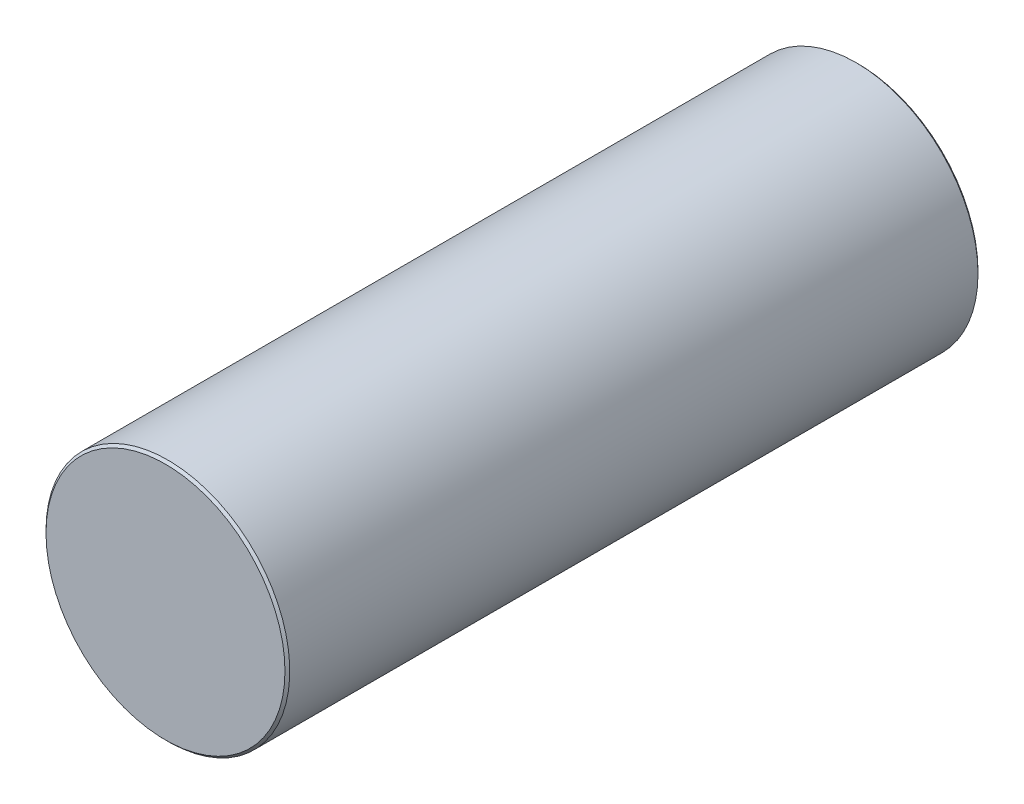
ISO-10303-21;
HEADER;
FILE_DESCRIPTION(('STEP AP214'),'2;1');
FILE_NAME('part.step','',(''),(''),'','','');
FILE_SCHEMA(('AUTOMOTIVE_DESIGN { 1 0 10303 214 1 1 1 1 }'));
ENDSEC;
DATA;
#1=APPLICATION_CONTEXT('core data for automotive mechanical design processes');
#2=APPLICATION_PROTOCOL_DEFINITION('international standard','automotive_design',2000,#1);
#3=PRODUCT_CONTEXT('',#1,'mechanical');
#4=PRODUCT('Part','Part','',(#3));
#5=PRODUCT_RELATED_PRODUCT_CATEGORY('part','',(#4));
#6=PRODUCT_DEFINITION_FORMATION('','',#4);
#7=PRODUCT_DEFINITION_CONTEXT('part definition',#1,'design');
#8=PRODUCT_DEFINITION('design','',#6,#7);
#9=PRODUCT_DEFINITION_SHAPE('','',#8);
#10=(LENGTH_UNIT() NAMED_UNIT(*) SI_UNIT(.MILLI.,.METRE.));
#11=(NAMED_UNIT(*) PLANE_ANGLE_UNIT() SI_UNIT($,.RADIAN.));
#12=(NAMED_UNIT(*) SI_UNIT($,.STERADIAN.) SOLID_ANGLE_UNIT());
#13=UNCERTAINTY_MEASURE_WITH_UNIT(LENGTH_MEASURE(1.E-05),#10,'distance_accuracy_value','');
#14=(GEOMETRIC_REPRESENTATION_CONTEXT(3) GLOBAL_UNCERTAINTY_ASSIGNED_CONTEXT((#13)) GLOBAL_UNIT_ASSIGNED_CONTEXT((#10,
#11,#12)) REPRESENTATION_CONTEXT('',''));
#15=CARTESIAN_POINT('',(0.,0.,0.));
#16=DIRECTION('',(0.,0.,1.));
#17=DIRECTION('',(1.,0.,0.));
#18=AXIS2_PLACEMENT_3D('',#15,#16,#17);
#19=CARTESIAN_POINT('',(0.,0.,14.5));
#20=DIRECTION('',(0.,0.,-1.));
#21=DIRECTION('',(-1.,0.,0.));
#22=AXIS2_PLACEMENT_3D('',#19,#20,#21);
#23=CYLINDRICAL_SURFACE('',#22,2.55);
#24=CARTESIAN_POINT('',(0.,0.,14.45));
#25=DIRECTION('',(0.,0.,1.));
#26=DIRECTION('',(1.,0.,0.));
#27=AXIS2_PLACEMENT_3D('',#24,#25,#26);
#28=CIRCLE('',#27,2.55);
#29=CARTESIAN_POINT('',(-2.55,0.,14.45));
#30=VERTEX_POINT('',#29);
#31=EDGE_CURVE('E54',#30,#30,#28,.F.);
#32=CARTESIAN_POINT('',(0.,0.,0.0500000000000136));
#33=DIRECTION('',(0.,0.,1.));
#34=DIRECTION('',(1.,0.,0.));
#35=AXIS2_PLACEMENT_3D('',#32,#33,#34);
#36=CIRCLE('',#35,2.55);
#37=CARTESIAN_POINT('',(-2.55,0.,0.0500000000000118));
#38=VERTEX_POINT('',#37);
#39=EDGE_CURVE('E59',#38,#38,#36,.T.);
#40=CARTESIAN_POINT('',(-2.55,0.,14.45));
#41=CARTESIAN_POINT('',(-2.55,0.,14.3));
#42=CARTESIAN_POINT('',(-2.55,0.,14.15));
#43=CARTESIAN_POINT('',(-2.55,0.,13.85));
#44=CARTESIAN_POINT('',(-2.55,0.,13.7));
#45=CARTESIAN_POINT('',(-2.55,0.,13.4));
#46=CARTESIAN_POINT('',(-2.55,0.,13.25));
#47=CARTESIAN_POINT('',(-2.55,0.,12.95));
#48=CARTESIAN_POINT('',(-2.55,0.,12.8));
#49=CARTESIAN_POINT('',(-2.55,0.,12.5));
#50=CARTESIAN_POINT('',(-2.55,0.,12.35));
#51=CARTESIAN_POINT('',(-2.55,0.,12.05));
#52=CARTESIAN_POINT('',(-2.55,0.,11.9));
#53=CARTESIAN_POINT('',(-2.55,0.,11.6));
#54=CARTESIAN_POINT('',(-2.55,0.,11.45));
#55=CARTESIAN_POINT('',(-2.55,0.,11.15));
#56=CARTESIAN_POINT('',(-2.55,0.,11.));
#57=CARTESIAN_POINT('',(-2.55,0.,10.7));
#58=CARTESIAN_POINT('',(-2.55,0.,10.55));
#59=CARTESIAN_POINT('',(-2.55,0.,10.25));
#60=CARTESIAN_POINT('',(-2.55,0.,10.1));
#61=CARTESIAN_POINT('',(-2.55,0.,9.80000000000001));
#62=CARTESIAN_POINT('',(-2.55,0.,9.65000000000001));
#63=CARTESIAN_POINT('',(-2.55,0.,9.35000000000001));
#64=CARTESIAN_POINT('',(-2.55,0.,9.20000000000001));
#65=CARTESIAN_POINT('',(-2.55,0.,8.90000000000001));
#66=CARTESIAN_POINT('',(-2.55,0.,8.75000000000001));
#67=CARTESIAN_POINT('',(-2.55,0.,8.45000000000001));
#68=CARTESIAN_POINT('',(-2.55,0.,8.30000000000001));
#69=CARTESIAN_POINT('',(-2.55,0.,8.00000000000001));
#70=CARTESIAN_POINT('',(-2.55,0.,7.85000000000001));
#71=CARTESIAN_POINT('',(-2.55,0.,7.55000000000001));
#72=CARTESIAN_POINT('',(-2.55,0.,7.40000000000001));
#73=CARTESIAN_POINT('',(-2.55,0.,7.10000000000001));
#74=CARTESIAN_POINT('',(-2.55,0.,6.95000000000001));
#75=CARTESIAN_POINT('',(-2.55,0.,6.65000000000001));
#76=CARTESIAN_POINT('',(-2.55,0.,6.50000000000001));
#77=CARTESIAN_POINT('',(-2.55,0.,6.20000000000001));
#78=CARTESIAN_POINT('',(-2.55,0.,6.05000000000001));
#79=CARTESIAN_POINT('',(-2.55,0.,5.75000000000001));
#80=CARTESIAN_POINT('',(-2.55,0.,5.60000000000001));
#81=CARTESIAN_POINT('',(-2.55,0.,5.30000000000001));
#82=CARTESIAN_POINT('',(-2.55,0.,5.15000000000001));
#83=CARTESIAN_POINT('',(-2.55,0.,4.85000000000001));
#84=CARTESIAN_POINT('',(-2.55,0.,4.70000000000001));
#85=CARTESIAN_POINT('',(-2.55,0.,4.40000000000001));
#86=CARTESIAN_POINT('',(-2.55,0.,4.25000000000001));
#87=CARTESIAN_POINT('',(-2.55,0.,3.95000000000001));
#88=CARTESIAN_POINT('',(-2.55,0.,3.80000000000001));
#89=CARTESIAN_POINT('',(-2.55,0.,3.50000000000001));
#90=CARTESIAN_POINT('',(-2.55,0.,3.35000000000001));
#91=CARTESIAN_POINT('',(-2.55,0.,3.05000000000001));
#92=CARTESIAN_POINT('',(-2.55,0.,2.90000000000001));
#93=CARTESIAN_POINT('',(-2.55,0.,2.60000000000001));
#94=CARTESIAN_POINT('',(-2.55,0.,2.45000000000001));
#95=CARTESIAN_POINT('',(-2.55,0.,2.15000000000001));
#96=CARTESIAN_POINT('',(-2.55,0.,2.00000000000001));
#97=CARTESIAN_POINT('',(-2.55,0.,1.70000000000001));
#98=CARTESIAN_POINT('',(-2.55,0.,1.55000000000001));
#99=CARTESIAN_POINT('',(-2.55,0.,1.25000000000001));
#100=CARTESIAN_POINT('',(-2.55,0.,1.10000000000001));
#101=CARTESIAN_POINT('',(-2.55,0.,0.80000000000001));
#102=CARTESIAN_POINT('',(-2.55,0.,0.65000000000001));
#103=CARTESIAN_POINT('',(-2.55,0.,0.350000000000011));
#104=CARTESIAN_POINT('',(-2.55,0.,0.200000000000012));
#105=CARTESIAN_POINT('',(-2.55,0.,0.0500000000000118));
#106=B_SPLINE_CURVE_WITH_KNOTS('',3,(#40,#41,#42,#43,#44,#45,#46,#47,#48,#49,#50,#51,#52,#53,
#54,#55,#56,#57,#58,#59,#60,#61,#62,#63,#64,#65,#66,#67,#68,#69,#70,#71,#72,#73,#74,#75,#76,#77,
#78,#79,#80,#81,#82,#83,#84,#85,#86,#87,#88,#89,#90,#91,#92,#93,#94,#95,#96,#97,#98,#99,#100,
#101,#102,#103,#104,#105),.UNSPECIFIED.,.F.,.F.,(4,2,2,2,2,2,2,2,2,2,2,2,2,2,2,2,2,2,2,2,2,2,2,
2,2,2,2,2,2,2,2,2,4),(0.,0.450000000000001,0.9,1.35,1.8,2.25,2.7,3.15,3.6,4.05,4.5,4.95,5.4,
5.85,6.3,6.75,7.2,7.65,8.1,8.55,9.,9.45,9.9,10.35,10.8,11.25,11.7,12.15,12.6,13.05,13.5,13.95,
14.4),.UNSPECIFIED.);
#107=EDGE_CURVE('BSEAM45',#30,#38,#106,.T.);
#108=ORIENTED_EDGE('',*,*,#31,.T.);
#109=ORIENTED_EDGE('',*,*,#39,.T.);
#110=ORIENTED_EDGE('',*,*,#107,.T.);
#111=ORIENTED_EDGE('',*,*,#107,.F.);
#112=EDGE_LOOP('',(#108,#110,#109,#111));
#113=FACE_BOUND('',#112,.T.);
#114=ADVANCED_FACE('F45',(#113),#23,.T.);
#115=CARTESIAN_POINT('',(0.,0.,14.5));
#116=DIRECTION('',(0.,0.,1.));
#117=DIRECTION('',(1.,0.,0.));
#118=AXIS2_PLACEMENT_3D('',#115,#116,#117);
#119=PLANE('',#118);
#120=CARTESIAN_POINT('',(0.,0.,14.5));
#121=DIRECTION('',(0.,0.,1.));
#122=DIRECTION('',(1.,0.,0.));
#123=AXIS2_PLACEMENT_3D('',#120,#121,#122);
#124=CIRCLE('',#123,2.50000000000001);
#125=CARTESIAN_POINT('',(-2.50000000000001,0.,14.5));
#126=VERTEX_POINT('',#125);
#127=EDGE_CURVE('E64',#126,#126,#124,.T.);
#128=ORIENTED_EDGE('',*,*,#127,.T.);
#129=EDGE_LOOP('',(#128));
#130=FACE_BOUND('',#129,.T.);
#131=ADVANCED_FACE('F71',(#130),#119,.T.);
#132=CARTESIAN_POINT('',(0.,0.,0.));
#133=DIRECTION('',(0.,0.,1.));
#134=DIRECTION('',(1.,0.,0.));
#135=AXIS2_PLACEMENT_3D('',#132,#133,#134);
#136=PLANE('',#135);
#137=CARTESIAN_POINT('',(0.,0.,0.));
#138=DIRECTION('',(0.,0.,1.));
#139=DIRECTION('',(1.,0.,0.));
#140=AXIS2_PLACEMENT_3D('',#137,#138,#139);
#141=CIRCLE('',#140,2.49999999999998);
#142=CARTESIAN_POINT('',(2.49999999999998,0.,0.));
#143=VERTEX_POINT('',#142);
#144=EDGE_CURVE('E10',#143,#143,#141,.F.);
#145=ORIENTED_EDGE('',*,*,#144,.T.);
#146=EDGE_LOOP('',(#145));
#147=FACE_BOUND('',#146,.T.);
#148=ADVANCED_FACE('F75',(#147),#136,.F.);
#149=CARTESIAN_POINT('',(0.,0.,14.5));
#150=DIRECTION('',(0.,0.,-1.));
#151=DIRECTION('',(-1.,0.,0.));
#152=AXIS2_PLACEMENT_3D('',#149,#150,#151);
#153=CONICAL_SURFACE('',#152,2.50000000000001,0.785398163397448);
#154=CARTESIAN_POINT('',(-2.55,0.,14.45));
#155=CARTESIAN_POINT('',(-2.54947916666667,0.,14.4505208333333));
#156=CARTESIAN_POINT('',(-2.54895833333333,0.,14.4510416666667));
#157=CARTESIAN_POINT('',(-2.54791666666667,0.,14.4520833333333));
#158=CARTESIAN_POINT('',(-2.54739583333333,0.,14.4526041666667));
#159=CARTESIAN_POINT('',(-2.54635416666667,0.,14.4536458333333));
#160=CARTESIAN_POINT('',(-2.54583333333333,0.,14.4541666666667));
#161=CARTESIAN_POINT('',(-2.54479166666667,0.,14.4552083333333));
#162=CARTESIAN_POINT('',(-2.54427083333333,0.,14.4557291666667));
#163=CARTESIAN_POINT('',(-2.54322916666667,0.,14.4567708333333));
#164=CARTESIAN_POINT('',(-2.54270833333333,0.,14.4572916666667));
#165=CARTESIAN_POINT('',(-2.54166666666667,0.,14.4583333333333));
#166=CARTESIAN_POINT('',(-2.54114583333333,0.,14.4588541666667));
#167=CARTESIAN_POINT('',(-2.54010416666667,0.,14.4598958333333));
#168=CARTESIAN_POINT('',(-2.53958333333334,0.,14.4604166666667));
#169=CARTESIAN_POINT('',(-2.53854166666667,0.,14.4614583333333));
#170=CARTESIAN_POINT('',(-2.53802083333334,0.,14.4619791666667));
#171=CARTESIAN_POINT('',(-2.53697916666667,0.,14.4630208333333));
#172=CARTESIAN_POINT('',(-2.53645833333334,0.,14.4635416666667));
#173=CARTESIAN_POINT('',(-2.53541666666667,0.,14.4645833333333));
#174=CARTESIAN_POINT('',(-2.53489583333334,0.,14.4651041666667));
#175=CARTESIAN_POINT('',(-2.53385416666667,0.,14.4661458333333));
#176=CARTESIAN_POINT('',(-2.53333333333334,0.,14.4666666666667));
#177=CARTESIAN_POINT('',(-2.53229166666667,0.,14.4677083333333));
#178=CARTESIAN_POINT('',(-2.53177083333334,0.,14.4682291666667));
#179=CARTESIAN_POINT('',(-2.53072916666667,0.,14.4692708333333));
#180=CARTESIAN_POINT('',(-2.53020833333334,0.,14.4697916666667));
#181=CARTESIAN_POINT('',(-2.52916666666667,0.,14.4708333333333));
#182=CARTESIAN_POINT('',(-2.52864583333334,0.,14.4713541666667));
#183=CARTESIAN_POINT('',(-2.52760416666667,0.,14.4723958333333));
#184=CARTESIAN_POINT('',(-2.52708333333334,0.,14.4729166666667));
#185=CARTESIAN_POINT('',(-2.52604166666667,0.,14.4739583333333));
#186=CARTESIAN_POINT('',(-2.52552083333334,0.,14.4744791666667));
#187=CARTESIAN_POINT('',(-2.52447916666667,0.,14.4755208333333));
#188=CARTESIAN_POINT('',(-2.52395833333334,0.,14.4760416666667));
#189=CARTESIAN_POINT('',(-2.52291666666667,0.,14.4770833333333));
#190=CARTESIAN_POINT('',(-2.52239583333334,0.,14.4776041666667));
#191=CARTESIAN_POINT('',(-2.52135416666667,0.,14.4786458333333));
#192=CARTESIAN_POINT('',(-2.52083333333334,0.,14.4791666666667));
#193=CARTESIAN_POINT('',(-2.51979166666667,0.,14.4802083333333));
#194=CARTESIAN_POINT('',(-2.51927083333334,0.,14.4807291666667));
#195=CARTESIAN_POINT('',(-2.51822916666667,0.,14.4817708333333));
#196=CARTESIAN_POINT('',(-2.51770833333334,0.,14.4822916666667));
#197=CARTESIAN_POINT('',(-2.51666666666667,0.,14.4833333333333));
#198=CARTESIAN_POINT('',(-2.51614583333334,0.,14.4838541666667));
#199=CARTESIAN_POINT('',(-2.51510416666667,0.,14.4848958333333));
#200=CARTESIAN_POINT('',(-2.51458333333334,0.,14.4854166666667));
#201=CARTESIAN_POINT('',(-2.51354166666667,0.,14.4864583333333));
#202=CARTESIAN_POINT('',(-2.51302083333334,0.,14.4869791666667));
#203=CARTESIAN_POINT('',(-2.51197916666667,0.,14.4880208333333));
#204=CARTESIAN_POINT('',(-2.51145833333334,0.,14.4885416666667));
#205=CARTESIAN_POINT('',(-2.51041666666667,0.,14.4895833333333));
#206=CARTESIAN_POINT('',(-2.50989583333334,0.,14.4901041666667));
#207=CARTESIAN_POINT('',(-2.50885416666667,0.,14.4911458333333));
#208=CARTESIAN_POINT('',(-2.50833333333334,0.,14.4916666666667));
#209=CARTESIAN_POINT('',(-2.50729166666667,0.,14.4927083333333));
#210=CARTESIAN_POINT('',(-2.50677083333334,0.,14.4932291666667));
#211=CARTESIAN_POINT('',(-2.50572916666667,0.,14.4942708333333));
#212=CARTESIAN_POINT('',(-2.50520833333334,0.,14.4947916666667));
#213=CARTESIAN_POINT('',(-2.50416666666667,0.,14.4958333333333));
#214=CARTESIAN_POINT('',(-2.50364583333334,0.,14.4963541666667));
#215=CARTESIAN_POINT('',(-2.50260416666667,0.,14.4973958333333));
#216=CARTESIAN_POINT('',(-2.50208333333334,0.,14.4979166666667));
#217=CARTESIAN_POINT('',(-2.50104166666667,0.,14.4989583333333));
#218=CARTESIAN_POINT('',(-2.50052083333334,0.,14.4994791666667));
#219=CARTESIAN_POINT('',(-2.50000000000001,0.,14.5));
#220=B_SPLINE_CURVE_WITH_KNOTS('',3,(#154,#155,#156,#157,#158,#159,#160,#161,#162,#163,#164,
#165,#166,#167,#168,#169,#170,#171,#172,#173,#174,#175,#176,#177,#178,#179,#180,#181,#182,#183,
#184,#185,#186,#187,#188,#189,#190,#191,#192,#193,#194,#195,#196,#197,#198,#199,#200,#201,#202,
#203,#204,#205,#206,#207,#208,#209,#210,#211,#212,#213,#214,#215,#216,#217,#218,#219),
.UNSPECIFIED.,.F.,.F.,(4,2,2,2,2,2,2,2,2,2,2,2,2,2,2,2,2,2,2,2,2,2,2,2,2,2,2,2,2,2,2,2,4),(0.,
0.00220970869120772,0.00441941738241544,0.00662912607362315,0.00883883476483087,
0.0110485434560386,0.0132582521472463,0.015467960838454,0.0176776695296617,0.0198873782208695,
0.0220970869120772,0.0243067956032849,0.0265165042944926,0.0287262129857003,0.030935921676908,
0.0331456303681158,0.0353553390593235,0.0375650477505312,0.0397747564417389,0.0419844651329466,
0.0441941738241544,0.0464038825153621,0.0486135912065698,0.0508232998977775,0.0530330085889852,
0.055242717280193,0.0574524259714007,0.0596621346626084,0.0618718433538161,0.0640815520450238,
0.0662912607362316,0.0685009694274393,0.070710678118647),.UNSPECIFIED.);
#221=EDGE_CURVE('BSEAM73',#30,#126,#220,.T.);
#222=ORIENTED_EDGE('',*,*,#31,.F.);
#223=ORIENTED_EDGE('',*,*,#127,.F.);
#224=ORIENTED_EDGE('',*,*,#221,.T.);
#225=ORIENTED_EDGE('',*,*,#221,.F.);
#226=EDGE_LOOP('',(#222,#224,#223,#225));
#227=FACE_BOUND('',#226,.T.);
#228=ADVANCED_FACE('F73',(#227),#153,.T.);
#229=CARTESIAN_POINT('',(0.,0.,0.0500000000000136));
#230=DIRECTION('',(0.,0.,1.));
#231=DIRECTION('',(1.,0.,0.));
#232=AXIS2_PLACEMENT_3D('',#229,#230,#231);
#233=CONICAL_SURFACE('',#232,2.55,0.785398163397466);
#234=ORIENTED_EDGE('',*,*,#144,.F.);
#235=EDGE_LOOP('',(#234));
#236=FACE_BOUND('',#235,.T.);
#237=ORIENTED_EDGE('',*,*,#39,.F.);
#238=EDGE_LOOP('',(#237));
#239=FACE_BOUND('',#238,.T.);
#240=ADVANCED_FACE('F48',(#236,#239),#233,.T.);
#241=CLOSED_SHELL('',(#114,#131,#148,#228,#240));
#242=MANIFOLD_SOLID_BREP('B2',#241);
#243=ADVANCED_BREP_SHAPE_REPRESENTATION('',(#18,#242),#14);
#244=SHAPE_DEFINITION_REPRESENTATION(#9,#243);
ENDSEC;
END-ISO-10303-21;
